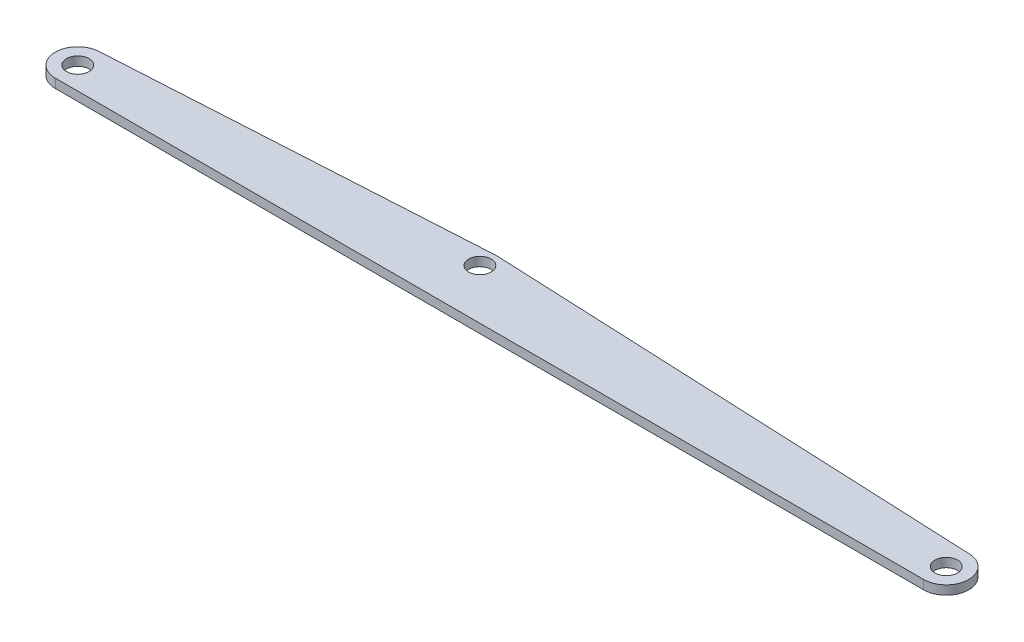
ISO-10303-21;
HEADER;
FILE_DESCRIPTION(('STEP AP214'),'2;1');
FILE_NAME('part.step','',(''),(''),'','','');
FILE_SCHEMA(('AUTOMOTIVE_DESIGN { 1 0 10303 214 1 1 1 1 }'));
ENDSEC;
DATA;
#1=APPLICATION_CONTEXT('core data for automotive mechanical design processes');
#2=APPLICATION_PROTOCOL_DEFINITION('international standard','automotive_design',2000,#1);
#3=PRODUCT_CONTEXT('',#1,'mechanical');
#4=PRODUCT('Part','Part','',(#3));
#5=PRODUCT_RELATED_PRODUCT_CATEGORY('part','',(#4));
#6=PRODUCT_DEFINITION_FORMATION('','',#4);
#7=PRODUCT_DEFINITION_CONTEXT('part definition',#1,'design');
#8=PRODUCT_DEFINITION('design','',#6,#7);
#9=PRODUCT_DEFINITION_SHAPE('','',#8);
#10=(LENGTH_UNIT() NAMED_UNIT(*) SI_UNIT(.MILLI.,.METRE.));
#11=(NAMED_UNIT(*) PLANE_ANGLE_UNIT() SI_UNIT($,.RADIAN.));
#12=(NAMED_UNIT(*) SI_UNIT($,.STERADIAN.) SOLID_ANGLE_UNIT());
#13=UNCERTAINTY_MEASURE_WITH_UNIT(LENGTH_MEASURE(1.E-05),#10,'distance_accuracy_value','');
#14=(GEOMETRIC_REPRESENTATION_CONTEXT(3) GLOBAL_UNCERTAINTY_ASSIGNED_CONTEXT((#13)) GLOBAL_UNIT_ASSIGNED_CONTEXT((#10,
#11,#12)) REPRESENTATION_CONTEXT('',''));
#15=CARTESIAN_POINT('',(0.,0.,0.));
#16=DIRECTION('',(0.,0.,1.));
#17=DIRECTION('',(1.,0.,0.));
#18=AXIS2_PLACEMENT_3D('',#15,#16,#17);
#19=CARTESIAN_POINT('',(0.,5.08,0.));
#20=DIRECTION('',(0.,-1.,0.));
#21=DIRECTION('',(0.,0.,-1.));
#22=AXIS2_PLACEMENT_3D('',#19,#20,#21);
#23=PLANE('',#22);
#24=CARTESIAN_POINT('',(0.,5.08,0.));
#25=DIRECTION('',(0.,1.,0.));
#26=DIRECTION('',(0.,0.,-1.));
#27=AXIS2_PLACEMENT_3D('',#24,#25,#26);
#28=CIRCLE('',#27,12.7);
#29=CARTESIAN_POINT('',(0.,5.08,12.7));
#30=VERTEX_POINT('',#29);
#31=CARTESIAN_POINT('',(0.,5.08,-12.7));
#32=VERTEX_POINT('',#31);
#33=EDGE_CURVE('E139',#30,#32,#28,.T.);
#34=ORIENTED_EDGE('',*,*,#33,.T.);
#35=DIRECTION('',(-0.999019396588181,0.,-0.0442746568658219));
#36=VECTOR('',#35,1.);
#37=CARTESIAN_POINT('',(0.,5.08,-12.7));
#38=LINE('',#37,#36);
#39=CARTESIAN_POINT('',(-278.146766675035,5.08,-25.0269404927795));
#40=VERTEX_POINT('',#39);
#41=EDGE_CURVE('E97',#32,#40,#38,.T.);
#42=ORIENTED_EDGE('',*,*,#41,.T.);
#43=CARTESIAN_POINT('',(-278.568482781682,5.08,-15.5112807402771));
#44=DIRECTION('',(0.,1.,0.));
#45=DIRECTION('',(0.,0.,1.));
#46=AXIS2_PLACEMENT_3D('',#43,#44,#45);
#47=CIRCLE('',#46,9.52500000000001);
#48=CARTESIAN_POINT('',(-279.12427989913,5.08,-25.0200511426076));
#49=VERTEX_POINT('',#48);
#50=EDGE_CURVE('E110',#40,#49,#47,.T.);
#51=ORIENTED_EDGE('',*,*,#50,.T.);
#52=DIRECTION('',(-0.99829610523155,0.,0.0583514034065814));
#53=VECTOR('',#52,1.);
#54=CARTESIAN_POINT('',(-489.9,5.08,-12.7000000000001));
#55=LINE('',#54,#53);
#56=CARTESIAN_POINT('',(-489.9,5.08,-12.7000000000001));
#57=VERTEX_POINT('',#56);
#58=EDGE_CURVE('E104',#49,#57,#55,.T.);
#59=ORIENTED_EDGE('',*,*,#58,.T.);
#60=CARTESIAN_POINT('',(-489.9,5.08,0.));
#61=DIRECTION('',(0.,1.,0.));
#62=DIRECTION('',(0.,0.,1.));
#63=AXIS2_PLACEMENT_3D('',#60,#61,#62);
#64=CIRCLE('',#63,12.7);
#65=CARTESIAN_POINT('',(-489.9,5.08,12.7));
#66=VERTEX_POINT('',#65);
#67=EDGE_CURVE('E108',#57,#66,#64,.T.);
#68=ORIENTED_EDGE('',*,*,#67,.T.);
#69=DIRECTION('',(1.,0.,0.));
#70=VECTOR('',#69,1.);
#71=CARTESIAN_POINT('',(-489.9,5.08,12.7));
#72=LINE('',#71,#70);
#73=EDGE_CURVE('E60',#66,#30,#72,.T.);
#74=ORIENTED_EDGE('',*,*,#73,.T.);
#75=EDGE_LOOP('',(#34,#42,#51,#59,#68,#74));
#76=FACE_BOUND('',#75,.T.);
#77=CARTESIAN_POINT('',(0.,5.08,0.));
#78=DIRECTION('',(0.,1.,0.));
#79=DIRECTION('',(0.,0.,1.));
#80=AXIS2_PLACEMENT_3D('',#77,#78,#79);
#81=CIRCLE('',#80,6.35);
#82=CARTESIAN_POINT('',(0.,5.08,6.35));
#83=VERTEX_POINT('',#82);
#84=EDGE_CURVE('E132',#83,#83,#81,.T.);
#85=ORIENTED_EDGE('',*,*,#84,.F.);
#86=EDGE_LOOP('',(#85));
#87=FACE_BOUND('',#86,.T.);
#88=CARTESIAN_POINT('',(-278.568482781682,5.08,-15.5112807402771));
#89=DIRECTION('',(0.,1.,0.));
#90=DIRECTION('',(0.,0.,1.));
#91=AXIS2_PLACEMENT_3D('',#88,#89,#90);
#92=CIRCLE('',#91,6.35);
#93=CARTESIAN_POINT('',(-278.568482781682,5.08,-9.16128074027707));
#94=VERTEX_POINT('',#93);
#95=EDGE_CURVE('E193',#94,#94,#92,.T.);
#96=ORIENTED_EDGE('',*,*,#95,.F.);
#97=EDGE_LOOP('',(#96));
#98=FACE_BOUND('',#97,.T.);
#99=CARTESIAN_POINT('',(-489.9,5.08,0.));
#100=DIRECTION('',(0.,1.,0.));
#101=DIRECTION('',(0.,0.,1.));
#102=AXIS2_PLACEMENT_3D('',#99,#100,#101);
#103=CIRCLE('',#102,6.35);
#104=CARTESIAN_POINT('',(-489.9,5.08,6.35000000000006));
#105=VERTEX_POINT('',#104);
#106=EDGE_CURVE('E184',#105,#105,#103,.T.);
#107=ORIENTED_EDGE('',*,*,#106,.F.);
#108=EDGE_LOOP('',(#107));
#109=FACE_BOUND('',#108,.T.);
#110=ADVANCED_FACE('F43',(#76,#87,#98,#109),#23,.F.);
#111=CARTESIAN_POINT('',(0.,0.,0.));
#112=DIRECTION('',(0.,-1.,0.));
#113=DIRECTION('',(0.,0.,-1.));
#114=AXIS2_PLACEMENT_3D('',#111,#112,#113);
#115=PLANE('',#114);
#116=CARTESIAN_POINT('',(-278.568482781682,0.,-15.5112807402771));
#117=DIRECTION('',(0.,1.,0.));
#118=DIRECTION('',(0.,0.,1.));
#119=AXIS2_PLACEMENT_3D('',#116,#117,#118);
#120=CIRCLE('',#119,6.35);
#121=CARTESIAN_POINT('',(-278.568482781682,0.,-9.16128074027707));
#122=VERTEX_POINT('',#121);
#123=EDGE_CURVE('E190',#122,#122,#120,.T.);
#124=ORIENTED_EDGE('',*,*,#123,.T.);
#125=EDGE_LOOP('',(#124));
#126=FACE_BOUND('',#125,.T.);
#127=CARTESIAN_POINT('',(0.,0.,0.));
#128=DIRECTION('',(0.,1.,0.));
#129=DIRECTION('',(0.,0.,-1.));
#130=AXIS2_PLACEMENT_3D('',#127,#128,#129);
#131=CIRCLE('',#130,12.7);
#132=CARTESIAN_POINT('',(0.,0.,12.7));
#133=VERTEX_POINT('',#132);
#134=CARTESIAN_POINT('',(0.,0.,-12.7));
#135=VERTEX_POINT('',#134);
#136=EDGE_CURVE('E128',#133,#135,#131,.T.);
#137=ORIENTED_EDGE('',*,*,#136,.F.);
#138=DIRECTION('',(1.,0.,0.));
#139=VECTOR('',#138,1.);
#140=CARTESIAN_POINT('',(-489.9,0.,12.7));
#141=LINE('',#140,#139);
#142=CARTESIAN_POINT('',(-489.9,0.,12.7));
#143=VERTEX_POINT('',#142);
#144=EDGE_CURVE('E89',#143,#133,#141,.T.);
#145=ORIENTED_EDGE('',*,*,#144,.F.);
#146=CARTESIAN_POINT('',(-489.9,0.,0.));
#147=DIRECTION('',(0.,1.,0.));
#148=DIRECTION('',(0.,0.,1.));
#149=AXIS2_PLACEMENT_3D('',#146,#147,#148);
#150=CIRCLE('',#149,12.7);
#151=CARTESIAN_POINT('',(-489.9,0.,-12.7000000000001));
#152=VERTEX_POINT('',#151);
#153=EDGE_CURVE('E83',#152,#143,#150,.T.);
#154=ORIENTED_EDGE('',*,*,#153,.F.);
#155=DIRECTION('',(-0.99829610523155,0.,0.0583514034065814));
#156=VECTOR('',#155,1.);
#157=CARTESIAN_POINT('',(-489.9,0.,-12.7000000000001));
#158=LINE('',#157,#156);
#159=CARTESIAN_POINT('',(-279.12427989913,0.,-25.0200511426076));
#160=VERTEX_POINT('',#159);
#161=EDGE_CURVE('E118',#160,#152,#158,.T.);
#162=ORIENTED_EDGE('',*,*,#161,.F.);
#163=CARTESIAN_POINT('',(-278.568482781682,0.,-15.5112807402771));
#164=DIRECTION('',(0.,1.,0.));
#165=DIRECTION('',(0.,0.,1.));
#166=AXIS2_PLACEMENT_3D('',#163,#164,#165);
#167=CIRCLE('',#166,9.52500000000001);
#168=CARTESIAN_POINT('',(-278.146766675035,0.,-25.0269404927795));
#169=VERTEX_POINT('',#168);
#170=EDGE_CURVE('E134',#169,#160,#167,.T.);
#171=ORIENTED_EDGE('',*,*,#170,.F.);
#172=DIRECTION('',(-0.999019396588181,0.,-0.0442746568658219));
#173=VECTOR('',#172,1.);
#174=CARTESIAN_POINT('',(0.,0.,-12.7));
#175=LINE('',#174,#173);
#176=EDGE_CURVE('E131',#135,#169,#175,.T.);
#177=ORIENTED_EDGE('',*,*,#176,.F.);
#178=EDGE_LOOP('',(#137,#145,#154,#162,#171,#177));
#179=FACE_BOUND('',#178,.T.);
#180=CARTESIAN_POINT('',(0.,0.,0.));
#181=DIRECTION('',(0.,1.,0.));
#182=DIRECTION('',(0.,0.,1.));
#183=AXIS2_PLACEMENT_3D('',#180,#181,#182);
#184=CIRCLE('',#183,6.35);
#185=CARTESIAN_POINT('',(0.,0.,6.35));
#186=VERTEX_POINT('',#185);
#187=EDGE_CURVE('E196',#186,#186,#184,.T.);
#188=ORIENTED_EDGE('',*,*,#187,.T.);
#189=EDGE_LOOP('',(#188));
#190=FACE_BOUND('',#189,.T.);
#191=CARTESIAN_POINT('',(-489.9,0.,0.));
#192=DIRECTION('',(0.,1.,0.));
#193=DIRECTION('',(0.,0.,1.));
#194=AXIS2_PLACEMENT_3D('',#191,#192,#193);
#195=CIRCLE('',#194,6.35);
#196=CARTESIAN_POINT('',(-489.9,0.,6.35000000000006));
#197=VERTEX_POINT('',#196);
#198=EDGE_CURVE('E187',#197,#197,#195,.T.);
#199=ORIENTED_EDGE('',*,*,#198,.T.);
#200=EDGE_LOOP('',(#199));
#201=FACE_BOUND('',#200,.T.);
#202=ADVANCED_FACE('F148',(#126,#179,#190,#201),#115,.T.);
#203=CARTESIAN_POINT('',(0.,5.08,0.));
#204=DIRECTION('',(0.,-1.,0.));
#205=DIRECTION('',(0.,0.,-1.));
#206=AXIS2_PLACEMENT_3D('',#203,#204,#205);
#207=CYLINDRICAL_SURFACE('',#206,12.7);
#208=ORIENTED_EDGE('',*,*,#136,.T.);
#209=DIRECTION('',(0.,-1.,0.));
#210=VECTOR('',#209,1.);
#211=CARTESIAN_POINT('',(0.,5.08,-12.7));
#212=LINE('',#211,#210);
#213=EDGE_CURVE('E11',#32,#135,#212,.T.);
#214=ORIENTED_EDGE('',*,*,#213,.F.);
#215=ORIENTED_EDGE('',*,*,#33,.F.);
#216=DIRECTION('',(0.,-1.,0.));
#217=VECTOR('',#216,1.);
#218=CARTESIAN_POINT('',(0.,5.08,12.7));
#219=LINE('',#218,#217);
#220=EDGE_CURVE('E124',#30,#133,#219,.T.);
#221=ORIENTED_EDGE('',*,*,#220,.T.);
#222=EDGE_LOOP('',(#208,#214,#215,#221));
#223=FACE_BOUND('',#222,.T.);
#224=ADVANCED_FACE('F45',(#223),#207,.T.);
#225=CARTESIAN_POINT('',(0.,5.08,-12.7));
#226=DIRECTION('',(-0.0442746568658219,0.,0.999019396588181));
#227=DIRECTION('',(0.999019396588181,0.,0.0442746568658219));
#228=AXIS2_PLACEMENT_3D('',#225,#226,#227);
#229=PLANE('',#228);
#230=ORIENTED_EDGE('',*,*,#176,.T.);
#231=DIRECTION('',(0.,-1.,0.));
#232=VECTOR('',#231,1.);
#233=CARTESIAN_POINT('',(-278.146766675035,5.08,-25.0269404927795));
#234=LINE('',#233,#232);
#235=EDGE_CURVE('E52',#40,#169,#234,.T.);
#236=ORIENTED_EDGE('',*,*,#235,.F.);
#237=ORIENTED_EDGE('',*,*,#41,.F.);
#238=ORIENTED_EDGE('',*,*,#213,.T.);
#239=EDGE_LOOP('',(#230,#236,#237,#238));
#240=FACE_BOUND('',#239,.T.);
#241=ADVANCED_FACE('F250',(#240),#229,.F.);
#242=CARTESIAN_POINT('',(-278.568482781682,5.08,-15.5112807402771));
#243=DIRECTION('',(0.,-1.,0.));
#244=DIRECTION('',(0.,0.,-1.));
#245=AXIS2_PLACEMENT_3D('',#242,#243,#244);
#246=CYLINDRICAL_SURFACE('',#245,9.52500000000001);
#247=ORIENTED_EDGE('',*,*,#170,.T.);
#248=DIRECTION('',(0.,-1.,0.));
#249=VECTOR('',#248,1.);
#250=CARTESIAN_POINT('',(-279.12427989913,5.08,-25.0200511426076));
#251=LINE('',#250,#249);
#252=EDGE_CURVE('E119',#49,#160,#251,.T.);
#253=ORIENTED_EDGE('',*,*,#252,.F.);
#254=ORIENTED_EDGE('',*,*,#50,.F.);
#255=ORIENTED_EDGE('',*,*,#235,.T.);
#256=EDGE_LOOP('',(#247,#253,#254,#255));
#257=FACE_BOUND('',#256,.T.);
#258=ADVANCED_FACE('F145',(#257),#246,.T.);
#259=CARTESIAN_POINT('',(-489.9,5.08,-12.7000000000001));
#260=DIRECTION('',(0.0583514034065814,0.,0.99829610523155));
#261=DIRECTION('',(0.99829610523155,0.,-0.0583514034065814));
#262=AXIS2_PLACEMENT_3D('',#259,#260,#261);
#263=PLANE('',#262);
#264=ORIENTED_EDGE('',*,*,#161,.T.);
#265=DIRECTION('',(0.,-1.,0.));
#266=VECTOR('',#265,1.);
#267=CARTESIAN_POINT('',(-489.9,5.08,-12.7000000000001));
#268=LINE('',#267,#266);
#269=EDGE_CURVE('E115',#57,#152,#268,.T.);
#270=ORIENTED_EDGE('',*,*,#269,.F.);
#271=ORIENTED_EDGE('',*,*,#58,.F.);
#272=ORIENTED_EDGE('',*,*,#252,.T.);
#273=EDGE_LOOP('',(#264,#270,#271,#272));
#274=FACE_BOUND('',#273,.T.);
#275=ADVANCED_FACE('F116',(#274),#263,.F.);
#276=CARTESIAN_POINT('',(-489.9,5.08,0.));
#277=DIRECTION('',(0.,-1.,0.));
#278=DIRECTION('',(0.,0.,-1.));
#279=AXIS2_PLACEMENT_3D('',#276,#277,#278);
#280=CYLINDRICAL_SURFACE('',#279,12.7);
#281=ORIENTED_EDGE('',*,*,#153,.T.);
#282=DIRECTION('',(0.,-1.,0.));
#283=VECTOR('',#282,1.);
#284=CARTESIAN_POINT('',(-489.9,5.08,12.7));
#285=LINE('',#284,#283);
#286=EDGE_CURVE('E120',#66,#143,#285,.T.);
#287=ORIENTED_EDGE('',*,*,#286,.F.);
#288=ORIENTED_EDGE('',*,*,#67,.F.);
#289=ORIENTED_EDGE('',*,*,#269,.T.);
#290=EDGE_LOOP('',(#281,#287,#288,#289));
#291=FACE_BOUND('',#290,.T.);
#292=ADVANCED_FACE('F122',(#291),#280,.T.);
#293=CARTESIAN_POINT('',(-489.9,5.08,12.7));
#294=DIRECTION('',(0.,0.,-1.));
#295=DIRECTION('',(-1.,0.,0.));
#296=AXIS2_PLACEMENT_3D('',#293,#294,#295);
#297=PLANE('',#296);
#298=ORIENTED_EDGE('',*,*,#144,.T.);
#299=ORIENTED_EDGE('',*,*,#220,.F.);
#300=ORIENTED_EDGE('',*,*,#73,.F.);
#301=ORIENTED_EDGE('',*,*,#286,.T.);
#302=EDGE_LOOP('',(#298,#299,#300,#301));
#303=FACE_BOUND('',#302,.T.);
#304=ADVANCED_FACE('F153',(#303),#297,.F.);
#305=CARTESIAN_POINT('',(0.,5.08,0.));
#306=DIRECTION('',(0.,-1.,0.));
#307=DIRECTION('',(0.,0.,-1.));
#308=AXIS2_PLACEMENT_3D('',#305,#306,#307);
#309=CYLINDRICAL_SURFACE('',#308,6.35);
#310=ORIENTED_EDGE('',*,*,#84,.T.);
#311=EDGE_LOOP('',(#310));
#312=FACE_BOUND('',#311,.T.);
#313=ORIENTED_EDGE('',*,*,#187,.F.);
#314=EDGE_LOOP('',(#313));
#315=FACE_BOUND('',#314,.T.);
#316=ADVANCED_FACE('F155',(#312,#315),#309,.F.);
#317=CARTESIAN_POINT('',(-278.568482781682,5.08,-15.5112807402771));
#318=DIRECTION('',(0.,-1.,0.));
#319=DIRECTION('',(0.,0.,-1.));
#320=AXIS2_PLACEMENT_3D('',#317,#318,#319);
#321=CYLINDRICAL_SURFACE('',#320,6.35);
#322=ORIENTED_EDGE('',*,*,#95,.T.);
#323=EDGE_LOOP('',(#322));
#324=FACE_BOUND('',#323,.T.);
#325=ORIENTED_EDGE('',*,*,#123,.F.);
#326=EDGE_LOOP('',(#325));
#327=FACE_BOUND('',#326,.T.);
#328=ADVANCED_FACE('F161',(#324,#327),#321,.F.);
#329=CARTESIAN_POINT('',(-489.9,5.08,0.));
#330=DIRECTION('',(0.,-1.,0.));
#331=DIRECTION('',(0.,0.,-1.));
#332=AXIS2_PLACEMENT_3D('',#329,#330,#331);
#333=CYLINDRICAL_SURFACE('',#332,6.35);
#334=ORIENTED_EDGE('',*,*,#106,.T.);
#335=EDGE_LOOP('',(#334));
#336=FACE_BOUND('',#335,.T.);
#337=ORIENTED_EDGE('',*,*,#198,.F.);
#338=EDGE_LOOP('',(#337));
#339=FACE_BOUND('',#338,.T.);
#340=ADVANCED_FACE('F175',(#336,#339),#333,.F.);
#341=CLOSED_SHELL('',(#110,#202,#224,#241,#258,#275,#292,#304,#316,#328,#340));
#342=MANIFOLD_SOLID_BREP('B2',#341);
#343=ADVANCED_BREP_SHAPE_REPRESENTATION('',(#18,#342),#14);
#344=SHAPE_DEFINITION_REPRESENTATION(#9,#343);
ENDSEC;
END-ISO-10303-21;
